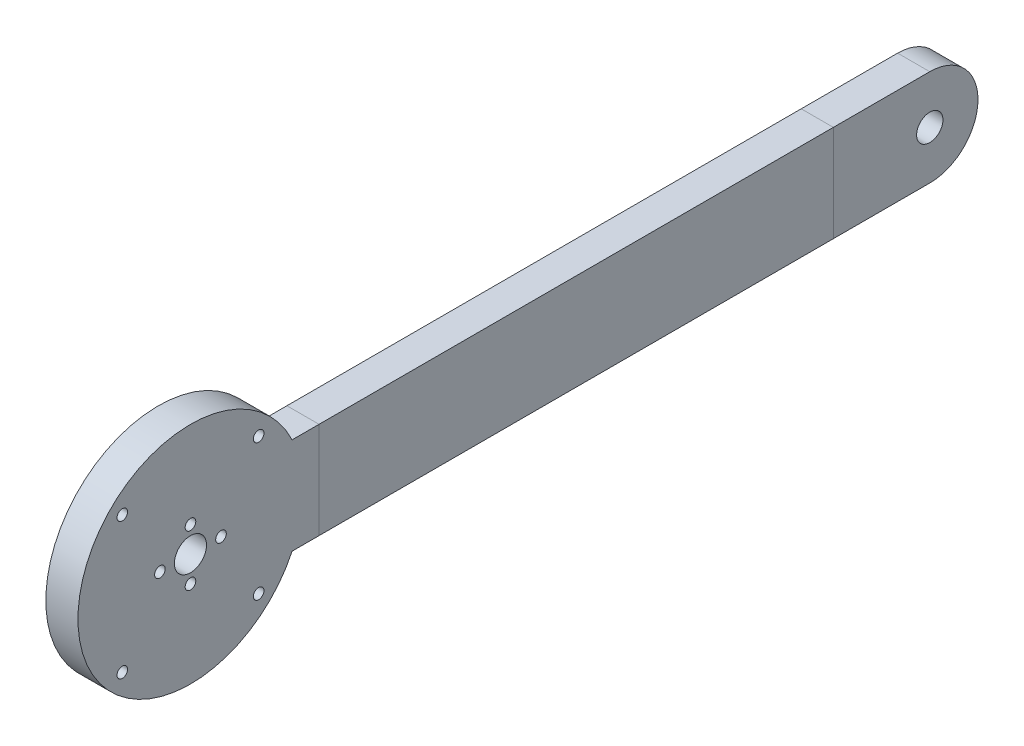
ISO-10303-21;
HEADER;
FILE_DESCRIPTION(('STEP AP214'),'2;1');
FILE_NAME('part.step','',(''),(''),'','','');
FILE_SCHEMA(('AUTOMOTIVE_DESIGN { 1 0 10303 214 1 1 1 1 }'));
ENDSEC;
DATA;
#1=APPLICATION_CONTEXT('core data for automotive mechanical design processes');
#2=APPLICATION_PROTOCOL_DEFINITION('international standard','automotive_design',2000,#1);
#3=PRODUCT_CONTEXT('',#1,'mechanical');
#4=PRODUCT('Part','Part','',(#3));
#5=PRODUCT_RELATED_PRODUCT_CATEGORY('part','',(#4));
#6=PRODUCT_DEFINITION_FORMATION('','',#4);
#7=PRODUCT_DEFINITION_CONTEXT('part definition',#1,'design');
#8=PRODUCT_DEFINITION('design','',#6,#7);
#9=PRODUCT_DEFINITION_SHAPE('','',#8);
#10=(LENGTH_UNIT() NAMED_UNIT(*) SI_UNIT(.MILLI.,.METRE.));
#11=(NAMED_UNIT(*) PLANE_ANGLE_UNIT() SI_UNIT($,.RADIAN.));
#12=(NAMED_UNIT(*) SI_UNIT($,.STERADIAN.) SOLID_ANGLE_UNIT());
#13=UNCERTAINTY_MEASURE_WITH_UNIT(LENGTH_MEASURE(1.E-05),#10,'distance_accuracy_value','');
#14=(GEOMETRIC_REPRESENTATION_CONTEXT(3) GLOBAL_UNCERTAINTY_ASSIGNED_CONTEXT((#13)) GLOBAL_UNIT_ASSIGNED_CONTEXT((#10,
#11,#12)) REPRESENTATION_CONTEXT('',''));
#15=CARTESIAN_POINT('',(0.,0.,0.));
#16=DIRECTION('',(0.,0.,1.));
#17=DIRECTION('',(1.,0.,0.));
#18=AXIS2_PLACEMENT_3D('',#15,#16,#17);
#19=CARTESIAN_POINT('',(0.,0.,30.));
#20=DIRECTION('',(0.,0.,1.));
#21=DIRECTION('',(1.,0.,0.));
#22=AXIS2_PLACEMENT_3D('',#19,#20,#21);
#23=PLANE('',#22);
#24=DIRECTION('',(1.,0.,0.));
#25=VECTOR('',#24,1.);
#26=CARTESIAN_POINT('',(10.,-15.,30.));
#27=LINE('',#26,#25);
#28=CARTESIAN_POINT('',(0.,-15.,30.));
#29=VERTEX_POINT('',#28);
#30=CARTESIAN_POINT('',(10.,-15.,30.));
#31=VERTEX_POINT('',#30);
#32=EDGE_CURVE('E105',#29,#31,#27,.T.);
#33=ORIENTED_EDGE('',*,*,#32,.T.);
#34=DIRECTION('',(0.,1.,0.));
#35=VECTOR('',#34,1.);
#36=CARTESIAN_POINT('',(10.,0.,30.));
#37=LINE('',#36,#35);
#38=CARTESIAN_POINT('',(10.,15.,30.));
#39=VERTEX_POINT('',#38);
#40=EDGE_CURVE('E107',#31,#39,#37,.T.);
#41=ORIENTED_EDGE('',*,*,#40,.T.);
#42=DIRECTION('',(-1.,0.,0.));
#43=VECTOR('',#42,1.);
#44=CARTESIAN_POINT('',(10.,15.,30.));
#45=LINE('',#44,#43);
#46=CARTESIAN_POINT('',(0.,15.,30.));
#47=VERTEX_POINT('',#46);
#48=EDGE_CURVE('E109',#39,#47,#45,.T.);
#49=ORIENTED_EDGE('',*,*,#48,.T.);
#50=DIRECTION('',(0.,1.,0.));
#51=VECTOR('',#50,1.);
#52=CARTESIAN_POINT('',(0.,0.,30.));
#53=LINE('',#52,#51);
#54=EDGE_CURVE('E95',#29,#47,#53,.T.);
#55=ORIENTED_EDGE('',*,*,#54,.F.);
#56=EDGE_LOOP('',(#33,#41,#49,#55));
#57=FACE_BOUND('',#56,.T.);
#58=ADVANCED_FACE('F53',(#57),#23,.T.);
#59=CARTESIAN_POINT('',(10.,0.,0.));
#60=DIRECTION('',(-1.,0.,0.));
#61=DIRECTION('',(0.,0.,1.));
#62=AXIS2_PLACEMENT_3D('',#59,#60,#61);
#63=CYLINDRICAL_SURFACE('',#62,15.);
#64=CARTESIAN_POINT('',(0.,0.,0.));
#65=DIRECTION('',(1.,0.,0.));
#66=DIRECTION('',(0.,0.,1.));
#67=AXIS2_PLACEMENT_3D('',#64,#65,#66);
#68=CIRCLE('',#67,15.);
#69=CARTESIAN_POINT('',(0.,-15.,0.));
#70=VERTEX_POINT('',#69);
#71=CARTESIAN_POINT('',(0.,15.,0.));
#72=VERTEX_POINT('',#71);
#73=EDGE_CURVE('E117',#70,#72,#68,.T.);
#74=ORIENTED_EDGE('',*,*,#73,.T.);
#75=DIRECTION('',(-1.,0.,0.));
#76=VECTOR('',#75,1.);
#77=CARTESIAN_POINT('',(10.,15.,0.));
#78=LINE('',#77,#76);
#79=CARTESIAN_POINT('',(10.,15.,0.));
#80=VERTEX_POINT('',#79);
#81=EDGE_CURVE('E129',#80,#72,#78,.T.);
#82=ORIENTED_EDGE('',*,*,#81,.F.);
#83=CARTESIAN_POINT('',(10.,0.,0.));
#84=DIRECTION('',(1.,0.,0.));
#85=DIRECTION('',(0.,0.,1.));
#86=AXIS2_PLACEMENT_3D('',#83,#84,#85);
#87=CIRCLE('',#86,15.);
#88=CARTESIAN_POINT('',(10.,-15.,0.));
#89=VERTEX_POINT('',#88);
#90=EDGE_CURVE('E119',#89,#80,#87,.T.);
#91=ORIENTED_EDGE('',*,*,#90,.F.);
#92=DIRECTION('',(-1.,0.,0.));
#93=VECTOR('',#92,1.);
#94=CARTESIAN_POINT('',(10.,-15.,0.));
#95=LINE('',#94,#93);
#96=EDGE_CURVE('E102',#89,#70,#95,.T.);
#97=ORIENTED_EDGE('',*,*,#96,.T.);
#98=EDGE_LOOP('',(#74,#82,#91,#97));
#99=FACE_BOUND('',#98,.T.);
#100=ADVANCED_FACE('F134',(#99),#63,.T.);
#101=CARTESIAN_POINT('',(10.,15.,0.));
#102=DIRECTION('',(0.,-1.,0.));
#103=DIRECTION('',(0.,0.,-1.));
#104=AXIS2_PLACEMENT_3D('',#101,#102,#103);
#105=PLANE('',#104);
#106=ORIENTED_EDGE('',*,*,#48,.F.);
#107=DIRECTION('',(0.,0.,1.));
#108=VECTOR('',#107,1.);
#109=CARTESIAN_POINT('',(10.,15.,0.));
#110=LINE('',#109,#108);
#111=EDGE_CURVE('E110',#80,#39,#110,.T.);
#112=ORIENTED_EDGE('',*,*,#111,.F.);
#113=ORIENTED_EDGE('',*,*,#81,.T.);
#114=DIRECTION('',(0.,0.,1.));
#115=VECTOR('',#114,1.);
#116=CARTESIAN_POINT('',(0.,15.,0.));
#117=LINE('',#116,#115);
#118=EDGE_CURVE('E74',#72,#47,#117,.T.);
#119=ORIENTED_EDGE('',*,*,#118,.T.);
#120=EDGE_LOOP('',(#106,#112,#113,#119));
#121=FACE_BOUND('',#120,.T.);
#122=ADVANCED_FACE('F128',(#121),#105,.F.);
#123=CARTESIAN_POINT('',(10.,-15.,0.));
#124=DIRECTION('',(0.,1.,0.));
#125=DIRECTION('',(0.,0.,1.));
#126=AXIS2_PLACEMENT_3D('',#123,#124,#125);
#127=PLANE('',#126);
#128=ORIENTED_EDGE('',*,*,#32,.F.);
#129=DIRECTION('',(0.,0.,-1.));
#130=VECTOR('',#129,1.);
#131=CARTESIAN_POINT('',(0.,-15.,0.));
#132=LINE('',#131,#130);
#133=EDGE_CURVE('E118',#29,#70,#132,.T.);
#134=ORIENTED_EDGE('',*,*,#133,.T.);
#135=ORIENTED_EDGE('',*,*,#96,.F.);
#136=DIRECTION('',(0.,0.,-1.));
#137=VECTOR('',#136,1.);
#138=CARTESIAN_POINT('',(10.,-15.,0.));
#139=LINE('',#138,#137);
#140=EDGE_CURVE('E59',#31,#89,#139,.T.);
#141=ORIENTED_EDGE('',*,*,#140,.F.);
#142=EDGE_LOOP('',(#128,#134,#135,#141));
#143=FACE_BOUND('',#142,.T.);
#144=ADVANCED_FACE('F103',(#143),#127,.F.);
#145=CARTESIAN_POINT('',(0.,0.,0.));
#146=DIRECTION('',(1.,0.,0.));
#147=DIRECTION('',(0.,0.,-1.));
#148=AXIS2_PLACEMENT_3D('',#145,#146,#147);
#149=CYLINDRICAL_SURFACE('',#148,4.1);
#150=CARTESIAN_POINT('',(0.,0.,0.));
#151=DIRECTION('',(1.,0.,0.));
#152=DIRECTION('',(0.,0.,-1.));
#153=AXIS2_PLACEMENT_3D('',#150,#151,#152);
#154=CIRCLE('',#153,4.1);
#155=CARTESIAN_POINT('',(0.,0.,-4.1));
#156=VERTEX_POINT('',#155);
#157=EDGE_CURVE('E61',#156,#156,#154,.T.);
#158=ORIENTED_EDGE('',*,*,#157,.F.);
#159=EDGE_LOOP('',(#158));
#160=FACE_BOUND('',#159,.T.);
#161=CARTESIAN_POINT('',(10.,0.,0.));
#162=DIRECTION('',(1.,0.,0.));
#163=DIRECTION('',(0.,0.,-1.));
#164=AXIS2_PLACEMENT_3D('',#161,#162,#163);
#165=CIRCLE('',#164,4.1);
#166=CARTESIAN_POINT('',(10.,0.,-4.1));
#167=VERTEX_POINT('',#166);
#168=EDGE_CURVE('E13',#167,#167,#165,.T.);
#169=ORIENTED_EDGE('',*,*,#168,.T.);
#170=EDGE_LOOP('',(#169));
#171=FACE_BOUND('',#170,.T.);
#172=ADVANCED_FACE('F137',(#160,#171),#149,.F.);
#173=CARTESIAN_POINT('',(0.,0.,0.));
#174=DIRECTION('',(-1.,0.,0.));
#175=DIRECTION('',(0.,0.,1.));
#176=AXIS2_PLACEMENT_3D('',#173,#174,#175);
#177=PLANE('',#176);
#178=ORIENTED_EDGE('',*,*,#157,.T.);
#179=EDGE_LOOP('',(#178));
#180=FACE_BOUND('',#179,.T.);
#181=ORIENTED_EDGE('',*,*,#133,.F.);
#182=ORIENTED_EDGE('',*,*,#54,.T.);
#183=ORIENTED_EDGE('',*,*,#118,.F.);
#184=ORIENTED_EDGE('',*,*,#73,.F.);
#185=EDGE_LOOP('',(#181,#182,#183,#184));
#186=FACE_BOUND('',#185,.T.);
#187=ADVANCED_FACE('F57',(#180,#186),#177,.T.);
#188=CARTESIAN_POINT('',(10.,0.,0.));
#189=DIRECTION('',(-1.,0.,0.));
#190=DIRECTION('',(0.,0.,1.));
#191=AXIS2_PLACEMENT_3D('',#188,#189,#190);
#192=PLANE('',#191);
#193=ORIENTED_EDGE('',*,*,#168,.F.);
#194=EDGE_LOOP('',(#193));
#195=FACE_BOUND('',#194,.T.);
#196=ORIENTED_EDGE('',*,*,#40,.F.);
#197=ORIENTED_EDGE('',*,*,#140,.T.);
#198=ORIENTED_EDGE('',*,*,#90,.T.);
#199=ORIENTED_EDGE('',*,*,#111,.T.);
#200=EDGE_LOOP('',(#196,#197,#198,#199));
#201=FACE_BOUND('',#200,.T.);
#202=ADVANCED_FACE('F115',(#195,#201),#192,.F.);
#203=CLOSED_SHELL('',(#58,#100,#122,#144,#172,#187,#202));
#204=MANIFOLD_SOLID_BREP('B2',#203);
#205=CARTESIAN_POINT('',(0.,0.,190.));
#206=DIRECTION('',(0.,0.,1.));
#207=DIRECTION('',(1.,0.,0.));
#208=AXIS2_PLACEMENT_3D('',#205,#206,#207);
#209=PLANE('',#208);
#210=DIRECTION('',(1.,0.,0.));
#211=VECTOR('',#210,1.);
#212=CARTESIAN_POINT('',(10.,-15.,190.));
#213=LINE('',#212,#211);
#214=CARTESIAN_POINT('',(0.,-15.,190.));
#215=VERTEX_POINT('',#214);
#216=CARTESIAN_POINT('',(10.,-15.,190.));
#217=VERTEX_POINT('',#216);
#218=EDGE_CURVE('E274',#215,#217,#213,.T.);
#219=ORIENTED_EDGE('',*,*,#218,.F.);
#220=DIRECTION('',(0.,1.,0.));
#221=VECTOR('',#220,1.);
#222=CARTESIAN_POINT('',(0.,0.,190.));
#223=LINE('',#222,#221);
#224=CARTESIAN_POINT('',(0.,15.,190.));
#225=VERTEX_POINT('',#224);
#226=EDGE_CURVE('E265',#215,#225,#223,.T.);
#227=ORIENTED_EDGE('',*,*,#226,.T.);
#228=DIRECTION('',(-1.,0.,0.));
#229=VECTOR('',#228,1.);
#230=CARTESIAN_POINT('',(10.,15.,190.));
#231=LINE('',#230,#229);
#232=CARTESIAN_POINT('',(10.,15.,190.));
#233=VERTEX_POINT('',#232);
#234=EDGE_CURVE('E272',#233,#225,#231,.T.);
#235=ORIENTED_EDGE('',*,*,#234,.F.);
#236=DIRECTION('',(0.,1.,0.));
#237=VECTOR('',#236,1.);
#238=CARTESIAN_POINT('',(10.,0.,190.));
#239=LINE('',#238,#237);
#240=EDGE_CURVE('E273',#217,#233,#239,.T.);
#241=ORIENTED_EDGE('',*,*,#240,.F.);
#242=EDGE_LOOP('',(#219,#227,#235,#241));
#243=FACE_BOUND('',#242,.T.);
#244=ADVANCED_FACE('F215',(#243),#209,.F.);
#245=CARTESIAN_POINT('',(10.,15.,0.));
#246=DIRECTION('',(0.,-1.,0.));
#247=DIRECTION('',(0.,0.,-1.));
#248=AXIS2_PLACEMENT_3D('',#245,#246,#247);
#249=PLANE('',#248);
#250=DIRECTION('',(0.,0.,1.));
#251=VECTOR('',#250,1.);
#252=CARTESIAN_POINT('',(10.,15.,0.));
#253=LINE('',#252,#251);
#254=CARTESIAN_POINT('',(10.,15.,198.377223398316));
#255=VERTEX_POINT('',#254);
#256=EDGE_CURVE('E217',#233,#255,#253,.T.);
#257=ORIENTED_EDGE('',*,*,#256,.F.);
#258=ORIENTED_EDGE('',*,*,#234,.T.);
#259=DIRECTION('',(0.,0.,1.));
#260=VECTOR('',#259,1.);
#261=CARTESIAN_POINT('',(0.,15.,0.));
#262=LINE('',#261,#260);
#263=CARTESIAN_POINT('',(0.,15.,198.377223398316));
#264=VERTEX_POINT('',#263);
#265=EDGE_CURVE('E230',#225,#264,#262,.T.);
#266=ORIENTED_EDGE('',*,*,#265,.T.);
#267=DIRECTION('',(1.,0.,0.));
#268=VECTOR('',#267,1.);
#269=CARTESIAN_POINT('',(0.,15.,198.377223398316));
#270=LINE('',#269,#268);
#271=EDGE_CURVE('E332',#264,#255,#270,.T.);
#272=ORIENTED_EDGE('',*,*,#271,.T.);
#273=EDGE_LOOP('',(#257,#258,#266,#272));
#274=FACE_BOUND('',#273,.T.);
#275=ADVANCED_FACE('F399',(#274),#249,.F.);
#276=CARTESIAN_POINT('',(10.,-15.,0.));
#277=DIRECTION('',(0.,1.,0.));
#278=DIRECTION('',(0.,0.,1.));
#279=AXIS2_PLACEMENT_3D('',#276,#277,#278);
#280=PLANE('',#279);
#281=DIRECTION('',(0.,0.,-1.));
#282=VECTOR('',#281,1.);
#283=CARTESIAN_POINT('',(0.,-15.,0.));
#284=LINE('',#283,#282);
#285=CARTESIAN_POINT('',(0.,-15.,198.377223398316));
#286=VERTEX_POINT('',#285);
#287=EDGE_CURVE('E269',#286,#215,#284,.T.);
#288=ORIENTED_EDGE('',*,*,#287,.T.);
#289=ORIENTED_EDGE('',*,*,#218,.T.);
#290=DIRECTION('',(0.,0.,-1.));
#291=VECTOR('',#290,1.);
#292=CARTESIAN_POINT('',(10.,-15.,0.));
#293=LINE('',#292,#291);
#294=CARTESIAN_POINT('',(10.,-15.,198.377223398316));
#295=VERTEX_POINT('',#294);
#296=EDGE_CURVE('E281',#295,#217,#293,.T.);
#297=ORIENTED_EDGE('',*,*,#296,.F.);
#298=DIRECTION('',(1.,0.,0.));
#299=VECTOR('',#298,1.);
#300=CARTESIAN_POINT('',(0.,-15.,198.377223398316));
#301=LINE('',#300,#299);
#302=EDGE_CURVE('E285',#295,#286,#301,.F.);
#303=ORIENTED_EDGE('',*,*,#302,.T.);
#304=EDGE_LOOP('',(#288,#289,#297,#303));
#305=FACE_BOUND('',#304,.T.);
#306=ADVANCED_FACE('F282',(#305),#280,.F.);
#307=CARTESIAN_POINT('',(10.,0.,0.));
#308=DIRECTION('',(-1.,0.,0.));
#309=DIRECTION('',(0.,0.,1.));
#310=AXIS2_PLACEMENT_3D('',#307,#308,#309);
#311=PLANE('',#310);
#312=CARTESIAN_POINT('',(10.,0.,239.5));
#313=DIRECTION('',(-1.,0.,0.));
#314=DIRECTION('',(0.,0.,1.));
#315=AXIS2_PLACEMENT_3D('',#312,#313,#314);
#316=CIRCLE('',#315,1.65000000000001);
#317=CARTESIAN_POINT('',(10.,0.,241.15));
#318=VERTEX_POINT('',#317);
#319=EDGE_CURVE('E292',#318,#318,#316,.T.);
#320=ORIENTED_EDGE('',*,*,#319,.T.);
#321=EDGE_LOOP('',(#320));
#322=FACE_BOUND('',#321,.T.);
#323=CARTESIAN_POINT('',(10.,-8.,230.));
#324=DIRECTION('',(-1.,0.,0.));
#325=DIRECTION('',(0.,0.,1.));
#326=AXIS2_PLACEMENT_3D('',#323,#324,#325);
#327=CIRCLE('',#326,1.65000000000001);
#328=CARTESIAN_POINT('',(10.,-8.,231.65));
#329=VERTEX_POINT('',#328);
#330=EDGE_CURVE('E294',#329,#329,#327,.T.);
#331=ORIENTED_EDGE('',*,*,#330,.T.);
#332=EDGE_LOOP('',(#331));
#333=FACE_BOUND('',#332,.T.);
#334=CARTESIAN_POINT('',(10.,0.,220.5));
#335=DIRECTION('',(-1.,0.,0.));
#336=DIRECTION('',(0.,0.,1.));
#337=AXIS2_PLACEMENT_3D('',#334,#335,#336);
#338=CIRCLE('',#337,1.65000000000001);
#339=CARTESIAN_POINT('',(10.,0.,222.15));
#340=VERTEX_POINT('',#339);
#341=EDGE_CURVE('E222',#340,#340,#338,.T.);
#342=ORIENTED_EDGE('',*,*,#341,.T.);
#343=EDGE_LOOP('',(#342));
#344=FACE_BOUND('',#343,.T.);
#345=CARTESIAN_POINT('',(10.,8.,230.));
#346=DIRECTION('',(-1.,0.,0.));
#347=DIRECTION('',(0.,0.,1.));
#348=AXIS2_PLACEMENT_3D('',#345,#346,#347);
#349=CIRCLE('',#348,1.65000000000001);
#350=CARTESIAN_POINT('',(10.,8.,231.65));
#351=VERTEX_POINT('',#350);
#352=EDGE_CURVE('E55',#351,#351,#349,.T.);
#353=ORIENTED_EDGE('',*,*,#352,.T.);
#354=EDGE_LOOP('',(#353));
#355=FACE_BOUND('',#354,.T.);
#356=CARTESIAN_POINT('',(10.,-21.2132034355964,208.786796564404));
#357=DIRECTION('',(1.,0.,0.));
#358=DIRECTION('',(0.,0.,-1.));
#359=AXIS2_PLACEMENT_3D('',#356,#357,#358);
#360=CIRCLE('',#359,1.65000000000001);
#361=CARTESIAN_POINT('',(10.,-21.2132034355964,207.136796564404));
#362=VERTEX_POINT('',#361);
#363=EDGE_CURVE('E313',#362,#362,#360,.T.);
#364=ORIENTED_EDGE('',*,*,#363,.F.);
#365=EDGE_LOOP('',(#364));
#366=FACE_BOUND('',#365,.T.);
#367=CARTESIAN_POINT('',(10.,21.2132034355964,208.786796564404));
#368=DIRECTION('',(1.,0.,0.));
#369=DIRECTION('',(0.,0.,-1.));
#370=AXIS2_PLACEMENT_3D('',#367,#368,#369);
#371=CIRCLE('',#370,1.65000000000001);
#372=CARTESIAN_POINT('',(10.,21.2132034355964,207.136796564404));
#373=VERTEX_POINT('',#372);
#374=EDGE_CURVE('E308',#373,#373,#371,.T.);
#375=ORIENTED_EDGE('',*,*,#374,.F.);
#376=EDGE_LOOP('',(#375));
#377=FACE_BOUND('',#376,.T.);
#378=CARTESIAN_POINT('',(10.,21.2132034355964,251.213203435596));
#379=DIRECTION('',(1.,0.,0.));
#380=DIRECTION('',(0.,0.,-1.));
#381=AXIS2_PLACEMENT_3D('',#378,#379,#380);
#382=CIRCLE('',#381,1.65000000000001);
#383=CARTESIAN_POINT('',(10.,21.2132034355964,249.563203435596));
#384=VERTEX_POINT('',#383);
#385=EDGE_CURVE('E301',#384,#384,#382,.T.);
#386=ORIENTED_EDGE('',*,*,#385,.F.);
#387=EDGE_LOOP('',(#386));
#388=FACE_BOUND('',#387,.T.);
#389=CARTESIAN_POINT('',(10.,-21.2132034355964,251.213203435596));
#390=DIRECTION('',(1.,0.,0.));
#391=DIRECTION('',(0.,0.,-1.));
#392=AXIS2_PLACEMENT_3D('',#389,#390,#391);
#393=CIRCLE('',#392,1.65000000000001);
#394=CARTESIAN_POINT('',(10.,-21.2132034355964,249.563203435596));
#395=VERTEX_POINT('',#394);
#396=EDGE_CURVE('E304',#395,#395,#393,.T.);
#397=ORIENTED_EDGE('',*,*,#396,.F.);
#398=EDGE_LOOP('',(#397));
#399=FACE_BOUND('',#398,.T.);
#400=ORIENTED_EDGE('',*,*,#296,.T.);
#401=ORIENTED_EDGE('',*,*,#240,.T.);
#402=ORIENTED_EDGE('',*,*,#256,.T.);
#403=CARTESIAN_POINT('',(10.,0.,230.));
#404=DIRECTION('',(1.,0.,0.));
#405=DIRECTION('',(0.,0.,-1.));
#406=AXIS2_PLACEMENT_3D('',#403,#404,#405);
#407=CIRCLE('',#406,35.);
#408=EDGE_CURVE('E321',#255,#295,#407,.T.);
#409=ORIENTED_EDGE('',*,*,#408,.T.);
#410=EDGE_LOOP('',(#400,#401,#402,#409));
#411=FACE_BOUND('',#410,.T.);
#412=CARTESIAN_POINT('',(10.,0.,230.));
#413=DIRECTION('',(1.,0.,0.));
#414=DIRECTION('',(0.,0.,-1.));
#415=AXIS2_PLACEMENT_3D('',#412,#413,#414);
#416=CIRCLE('',#415,5.00000000000001);
#417=CARTESIAN_POINT('',(10.,0.,225.));
#418=VERTEX_POINT('',#417);
#419=EDGE_CURVE('E334',#418,#418,#416,.T.);
#420=ORIENTED_EDGE('',*,*,#419,.F.);
#421=EDGE_LOOP('',(#420));
#422=FACE_BOUND('',#421,.T.);
#423=ADVANCED_FACE('F211',(#322,#333,#344,#355,#366,#377,#388,#399,#411,#422),#311,.F.);
#424=CARTESIAN_POINT('',(0.,0.,0.));
#425=DIRECTION('',(-1.,0.,0.));
#426=DIRECTION('',(0.,0.,1.));
#427=AXIS2_PLACEMENT_3D('',#424,#425,#426);
#428=PLANE('',#427);
#429=ORIENTED_EDGE('',*,*,#226,.F.);
#430=ORIENTED_EDGE('',*,*,#287,.F.);
#431=CARTESIAN_POINT('',(0.,0.,230.));
#432=DIRECTION('',(1.,0.,0.));
#433=DIRECTION('',(0.,0.,-1.));
#434=AXIS2_PLACEMENT_3D('',#431,#432,#433);
#435=CIRCLE('',#434,35.);
#436=EDGE_CURVE('E330',#264,#286,#435,.T.);
#437=ORIENTED_EDGE('',*,*,#436,.F.);
#438=ORIENTED_EDGE('',*,*,#265,.F.);
#439=EDGE_LOOP('',(#429,#430,#437,#438));
#440=FACE_BOUND('',#439,.T.);
#441=CARTESIAN_POINT('',(0.,0.,239.5));
#442=DIRECTION('',(-1.,0.,0.));
#443=DIRECTION('',(0.,0.,1.));
#444=AXIS2_PLACEMENT_3D('',#441,#442,#443);
#445=CIRCLE('',#444,3.);
#446=CARTESIAN_POINT('',(0.,0.,242.5));
#447=VERTEX_POINT('',#446);
#448=EDGE_CURVE('E293',#447,#447,#445,.F.);
#449=ORIENTED_EDGE('',*,*,#448,.T.);
#450=EDGE_LOOP('',(#449));
#451=FACE_BOUND('',#450,.T.);
#452=CARTESIAN_POINT('',(0.,0.,220.5));
#453=DIRECTION('',(-1.,0.,0.));
#454=DIRECTION('',(0.,0.,1.));
#455=AXIS2_PLACEMENT_3D('',#452,#453,#454);
#456=CIRCLE('',#455,3.);
#457=CARTESIAN_POINT('',(0.,0.,223.5));
#458=VERTEX_POINT('',#457);
#459=EDGE_CURVE('E342',#458,#458,#456,.F.);
#460=ORIENTED_EDGE('',*,*,#459,.T.);
#461=EDGE_LOOP('',(#460));
#462=FACE_BOUND('',#461,.T.);
#463=CARTESIAN_POINT('',(0.,-21.2132034355964,208.786796564404));
#464=DIRECTION('',(1.,0.,0.));
#465=DIRECTION('',(0.,0.,-1.));
#466=AXIS2_PLACEMENT_3D('',#463,#464,#465);
#467=CIRCLE('',#466,1.65000000000001);
#468=CARTESIAN_POINT('',(0.,-21.2132034355964,207.136796564404));
#469=VERTEX_POINT('',#468);
#470=EDGE_CURVE('E320',#469,#469,#467,.T.);
#471=ORIENTED_EDGE('',*,*,#470,.T.);
#472=EDGE_LOOP('',(#471));
#473=FACE_BOUND('',#472,.T.);
#474=CARTESIAN_POINT('',(0.,21.2132034355964,208.786796564404));
#475=DIRECTION('',(1.,0.,0.));
#476=DIRECTION('',(0.,0.,-1.));
#477=AXIS2_PLACEMENT_3D('',#474,#475,#476);
#478=CIRCLE('',#477,1.65000000000001);
#479=CARTESIAN_POINT('',(0.,21.2132034355964,207.136796564404));
#480=VERTEX_POINT('',#479);
#481=EDGE_CURVE('E311',#480,#480,#478,.T.);
#482=ORIENTED_EDGE('',*,*,#481,.T.);
#483=EDGE_LOOP('',(#482));
#484=FACE_BOUND('',#483,.T.);
#485=CARTESIAN_POINT('',(0.,21.2132034355964,251.213203435596));
#486=DIRECTION('',(1.,0.,0.));
#487=DIRECTION('',(0.,0.,-1.));
#488=AXIS2_PLACEMENT_3D('',#485,#486,#487);
#489=CIRCLE('',#488,1.65000000000001);
#490=CARTESIAN_POINT('',(0.,21.2132034355964,249.563203435596));
#491=VERTEX_POINT('',#490);
#492=EDGE_CURVE('E302',#491,#491,#489,.T.);
#493=ORIENTED_EDGE('',*,*,#492,.T.);
#494=EDGE_LOOP('',(#493));
#495=FACE_BOUND('',#494,.T.);
#496=CARTESIAN_POINT('',(0.,-21.2132034355964,251.213203435596));
#497=DIRECTION('',(1.,0.,0.));
#498=DIRECTION('',(0.,0.,-1.));
#499=AXIS2_PLACEMENT_3D('',#496,#497,#498);
#500=CIRCLE('',#499,1.65000000000001);
#501=CARTESIAN_POINT('',(0.,-21.2132034355964,249.563203435596));
#502=VERTEX_POINT('',#501);
#503=EDGE_CURVE('E322',#502,#502,#500,.T.);
#504=ORIENTED_EDGE('',*,*,#503,.T.);
#505=EDGE_LOOP('',(#504));
#506=FACE_BOUND('',#505,.T.);
#507=CARTESIAN_POINT('',(0.,0.,230.));
#508=DIRECTION('',(1.,0.,0.));
#509=DIRECTION('',(0.,0.,-1.));
#510=AXIS2_PLACEMENT_3D('',#507,#508,#509);
#511=CIRCLE('',#510,5.00000000000001);
#512=CARTESIAN_POINT('',(0.,5.,230.));
#513=VERTEX_POINT('',#512);
#514=CARTESIAN_POINT('',(0.,-5.,230.));
#515=VERTEX_POINT('',#514);
#516=EDGE_CURVE('E284',#513,#515,#511,.T.);
#517=ORIENTED_EDGE('',*,*,#516,.T.);
#518=CARTESIAN_POINT('',(0.,-8.,230.));
#519=DIRECTION('',(-1.,0.,0.));
#520=DIRECTION('',(0.,0.,1.));
#521=AXIS2_PLACEMENT_3D('',#518,#519,#520);
#522=CIRCLE('',#521,3.);
#523=EDGE_CURVE('E341',#515,#515,#522,.F.);
#524=ORIENTED_EDGE('',*,*,#523,.T.);
#525=EDGE_CURVE('E337',#515,#513,#511,.T.);
#526=ORIENTED_EDGE('',*,*,#525,.T.);
#527=CARTESIAN_POINT('',(0.,8.,230.));
#528=DIRECTION('',(-1.,0.,0.));
#529=DIRECTION('',(0.,0.,1.));
#530=AXIS2_PLACEMENT_3D('',#527,#528,#529);
#531=CIRCLE('',#530,3.);
#532=EDGE_CURVE('E290',#513,#513,#531,.F.);
#533=ORIENTED_EDGE('',*,*,#532,.T.);
#534=EDGE_LOOP('',(#517,#524,#526,#533));
#535=FACE_BOUND('',#534,.T.);
#536=ADVANCED_FACE('F264',(#440,#451,#462,#473,#484,#495,#506,#535),#428,.T.);
#537=CARTESIAN_POINT('',(0.,0.,230.));
#538=DIRECTION('',(1.,0.,0.));
#539=DIRECTION('',(0.,0.,-1.));
#540=AXIS2_PLACEMENT_3D('',#537,#538,#539);
#541=CYLINDRICAL_SURFACE('',#540,5.00000000000001);
#542=ORIENTED_EDGE('',*,*,#516,.F.);
#543=ORIENTED_EDGE('',*,*,#525,.F.);
#544=EDGE_LOOP('',(#542,#543));
#545=FACE_BOUND('',#544,.T.);
#546=ORIENTED_EDGE('',*,*,#419,.T.);
#547=EDGE_LOOP('',(#546));
#548=FACE_BOUND('',#547,.T.);
#549=ADVANCED_FACE('F375',(#545,#548),#541,.F.);
#550=CARTESIAN_POINT('',(0.,0.,230.));
#551=DIRECTION('',(1.,0.,0.));
#552=DIRECTION('',(0.,0.,-1.));
#553=AXIS2_PLACEMENT_3D('',#550,#551,#552);
#554=CYLINDRICAL_SURFACE('',#553,35.);
#555=ORIENTED_EDGE('',*,*,#271,.F.);
#556=ORIENTED_EDGE('',*,*,#436,.T.);
#557=ORIENTED_EDGE('',*,*,#302,.F.);
#558=ORIENTED_EDGE('',*,*,#408,.F.);
#559=EDGE_LOOP('',(#555,#556,#557,#558));
#560=FACE_BOUND('',#559,.T.);
#561=ADVANCED_FACE('F386',(#560),#554,.T.);
#562=CARTESIAN_POINT('',(0.,-21.2132034355964,251.213203435596));
#563=DIRECTION('',(1.,0.,0.));
#564=DIRECTION('',(0.,0.,-1.));
#565=AXIS2_PLACEMENT_3D('',#562,#563,#564);
#566=CYLINDRICAL_SURFACE('',#565,1.65000000000001);
#567=ORIENTED_EDGE('',*,*,#503,.F.);
#568=EDGE_LOOP('',(#567));
#569=FACE_BOUND('',#568,.T.);
#570=ORIENTED_EDGE('',*,*,#396,.T.);
#571=EDGE_LOOP('',(#570));
#572=FACE_BOUND('',#571,.T.);
#573=ADVANCED_FACE('F429',(#569,#572),#566,.F.);
#574=CARTESIAN_POINT('',(0.,21.2132034355964,251.213203435596));
#575=DIRECTION('',(1.,0.,0.));
#576=DIRECTION('',(0.,0.,-1.));
#577=AXIS2_PLACEMENT_3D('',#574,#575,#576);
#578=CYLINDRICAL_SURFACE('',#577,1.65000000000001);
#579=ORIENTED_EDGE('',*,*,#492,.F.);
#580=EDGE_LOOP('',(#579));
#581=FACE_BOUND('',#580,.T.);
#582=ORIENTED_EDGE('',*,*,#385,.T.);
#583=EDGE_LOOP('',(#582));
#584=FACE_BOUND('',#583,.T.);
#585=ADVANCED_FACE('F424',(#581,#584),#578,.F.);
#586=CARTESIAN_POINT('',(0.,21.2132034355964,208.786796564404));
#587=DIRECTION('',(1.,0.,0.));
#588=DIRECTION('',(0.,0.,-1.));
#589=AXIS2_PLACEMENT_3D('',#586,#587,#588);
#590=CYLINDRICAL_SURFACE('',#589,1.65000000000001);
#591=ORIENTED_EDGE('',*,*,#481,.F.);
#592=EDGE_LOOP('',(#591));
#593=FACE_BOUND('',#592,.T.);
#594=ORIENTED_EDGE('',*,*,#374,.T.);
#595=EDGE_LOOP('',(#594));
#596=FACE_BOUND('',#595,.T.);
#597=ADVANCED_FACE('F426',(#593,#596),#590,.F.);
#598=CARTESIAN_POINT('',(0.,-21.2132034355964,208.786796564404));
#599=DIRECTION('',(1.,0.,0.));
#600=DIRECTION('',(0.,0.,-1.));
#601=AXIS2_PLACEMENT_3D('',#598,#599,#600);
#602=CYLINDRICAL_SURFACE('',#601,1.65000000000001);
#603=ORIENTED_EDGE('',*,*,#470,.F.);
#604=EDGE_LOOP('',(#603));
#605=FACE_BOUND('',#604,.T.);
#606=ORIENTED_EDGE('',*,*,#363,.T.);
#607=EDGE_LOOP('',(#606));
#608=FACE_BOUND('',#607,.T.);
#609=ADVANCED_FACE('F370',(#605,#608),#602,.F.);
#610=CARTESIAN_POINT('',(0.,0.,239.5));
#611=DIRECTION('',(-1.,0.,0.));
#612=DIRECTION('',(0.,0.,1.));
#613=AXIS2_PLACEMENT_3D('',#610,#611,#612);
#614=CONICAL_SURFACE('',#613,3.,0.785398163397456);
#615=CARTESIAN_POINT('',(1.34999999999997,0.,239.5));
#616=DIRECTION('',(-1.,0.,0.));
#617=DIRECTION('',(0.,0.,1.));
#618=AXIS2_PLACEMENT_3D('',#615,#616,#617);
#619=CIRCLE('',#618,1.65000000000001);
#620=CARTESIAN_POINT('',(1.34999999999997,0.,241.15));
#621=VERTEX_POINT('',#620);
#622=EDGE_CURVE('E318',#621,#621,#619,.T.);
#623=ORIENTED_EDGE('',*,*,#622,.F.);
#624=EDGE_LOOP('',(#623));
#625=FACE_BOUND('',#624,.T.);
#626=ORIENTED_EDGE('',*,*,#448,.F.);
#627=EDGE_LOOP('',(#626));
#628=FACE_BOUND('',#627,.T.);
#629=ADVANCED_FACE('F361',(#625,#628),#614,.F.);
#630=CARTESIAN_POINT('',(0.,-8.,230.));
#631=DIRECTION('',(-1.,0.,0.));
#632=DIRECTION('',(0.,0.,1.));
#633=AXIS2_PLACEMENT_3D('',#630,#631,#632);
#634=CONICAL_SURFACE('',#633,3.,0.785398163397456);
#635=CARTESIAN_POINT('',(1.34999999999997,-8.,230.));
#636=DIRECTION('',(-1.,0.,0.));
#637=DIRECTION('',(0.,0.,1.));
#638=AXIS2_PLACEMENT_3D('',#635,#636,#637);
#639=CIRCLE('',#638,1.65000000000001);
#640=CARTESIAN_POINT('',(1.34999999999997,-8.,231.65));
#641=VERTEX_POINT('',#640);
#642=EDGE_CURVE('E351',#641,#641,#639,.T.);
#643=ORIENTED_EDGE('',*,*,#642,.F.);
#644=EDGE_LOOP('',(#643));
#645=FACE_BOUND('',#644,.T.);
#646=ORIENTED_EDGE('',*,*,#523,.F.);
#647=EDGE_LOOP('',(#646));
#648=FACE_BOUND('',#647,.T.);
#649=ADVANCED_FACE('F366',(#645,#648),#634,.F.);
#650=CARTESIAN_POINT('',(0.,0.,220.5));
#651=DIRECTION('',(-1.,0.,0.));
#652=DIRECTION('',(0.,0.,1.));
#653=AXIS2_PLACEMENT_3D('',#650,#651,#652);
#654=CONICAL_SURFACE('',#653,3.,0.785398163397456);
#655=CARTESIAN_POINT('',(1.34999999999997,0.,220.5));
#656=DIRECTION('',(-1.,0.,0.));
#657=DIRECTION('',(0.,0.,1.));
#658=AXIS2_PLACEMENT_3D('',#655,#656,#657);
#659=CIRCLE('',#658,1.65000000000001);
#660=CARTESIAN_POINT('',(1.34999999999997,0.,222.15));
#661=VERTEX_POINT('',#660);
#662=EDGE_CURVE('E352',#661,#661,#659,.T.);
#663=ORIENTED_EDGE('',*,*,#662,.F.);
#664=EDGE_LOOP('',(#663));
#665=FACE_BOUND('',#664,.T.);
#666=ORIENTED_EDGE('',*,*,#459,.F.);
#667=EDGE_LOOP('',(#666));
#668=FACE_BOUND('',#667,.T.);
#669=ADVANCED_FACE('F455',(#665,#668),#654,.F.);
#670=CARTESIAN_POINT('',(0.,8.,230.));
#671=DIRECTION('',(-1.,0.,0.));
#672=DIRECTION('',(0.,0.,1.));
#673=AXIS2_PLACEMENT_3D('',#670,#671,#672);
#674=CONICAL_SURFACE('',#673,3.,0.785398163397456);
#675=CARTESIAN_POINT('',(1.34999999999997,8.,230.));
#676=DIRECTION('',(-1.,0.,0.));
#677=DIRECTION('',(0.,0.,1.));
#678=AXIS2_PLACEMENT_3D('',#675,#676,#677);
#679=CIRCLE('',#678,1.65000000000001);
#680=CARTESIAN_POINT('',(1.34999999999997,8.,231.65));
#681=VERTEX_POINT('',#680);
#682=EDGE_CURVE('E298',#681,#681,#679,.T.);
#683=ORIENTED_EDGE('',*,*,#682,.F.);
#684=EDGE_LOOP('',(#683));
#685=FACE_BOUND('',#684,.T.);
#686=ORIENTED_EDGE('',*,*,#532,.F.);
#687=EDGE_LOOP('',(#686));
#688=FACE_BOUND('',#687,.T.);
#689=ADVANCED_FACE('F421',(#685,#688),#674,.F.);
#690=CARTESIAN_POINT('',(10.,8.,230.));
#691=DIRECTION('',(-1.,0.,0.));
#692=DIRECTION('',(0.,0.,1.));
#693=AXIS2_PLACEMENT_3D('',#690,#691,#692);
#694=CYLINDRICAL_SURFACE('',#693,1.65000000000001);
#695=ORIENTED_EDGE('',*,*,#682,.T.);
#696=EDGE_LOOP('',(#695));
#697=FACE_BOUND('',#696,.T.);
#698=ORIENTED_EDGE('',*,*,#352,.F.);
#699=EDGE_LOOP('',(#698));
#700=FACE_BOUND('',#699,.T.);
#701=ADVANCED_FACE('F416',(#697,#700),#694,.F.);
#702=CARTESIAN_POINT('',(10.,0.,220.5));
#703=DIRECTION('',(-1.,0.,0.));
#704=DIRECTION('',(0.,0.,1.));
#705=AXIS2_PLACEMENT_3D('',#702,#703,#704);
#706=CYLINDRICAL_SURFACE('',#705,1.65000000000001);
#707=ORIENTED_EDGE('',*,*,#662,.T.);
#708=EDGE_LOOP('',(#707));
#709=FACE_BOUND('',#708,.T.);
#710=ORIENTED_EDGE('',*,*,#341,.F.);
#711=EDGE_LOOP('',(#710));
#712=FACE_BOUND('',#711,.T.);
#713=ADVANCED_FACE('F413',(#709,#712),#706,.F.);
#714=CARTESIAN_POINT('',(10.,-8.,230.));
#715=DIRECTION('',(-1.,0.,0.));
#716=DIRECTION('',(0.,0.,1.));
#717=AXIS2_PLACEMENT_3D('',#714,#715,#716);
#718=CYLINDRICAL_SURFACE('',#717,1.65000000000001);
#719=ORIENTED_EDGE('',*,*,#642,.T.);
#720=EDGE_LOOP('',(#719));
#721=FACE_BOUND('',#720,.T.);
#722=ORIENTED_EDGE('',*,*,#330,.F.);
#723=EDGE_LOOP('',(#722));
#724=FACE_BOUND('',#723,.T.);
#725=ADVANCED_FACE('F406',(#721,#724),#718,.F.);
#726=CARTESIAN_POINT('',(10.,0.,239.5));
#727=DIRECTION('',(-1.,0.,0.));
#728=DIRECTION('',(0.,0.,1.));
#729=AXIS2_PLACEMENT_3D('',#726,#727,#728);
#730=CYLINDRICAL_SURFACE('',#729,1.65000000000001);
#731=ORIENTED_EDGE('',*,*,#622,.T.);
#732=EDGE_LOOP('',(#731));
#733=FACE_BOUND('',#732,.T.);
#734=ORIENTED_EDGE('',*,*,#319,.F.);
#735=EDGE_LOOP('',(#734));
#736=FACE_BOUND('',#735,.T.);
#737=ADVANCED_FACE('F359',(#733,#736),#730,.F.);
#738=CLOSED_SHELL('',(#244,#275,#306,#423,#536,#549,#561,#573,#585,#597,#609,#629,#649,#669,
#689,#701,#713,#725,#737));
#739=MANIFOLD_SOLID_BREP('B7',#738);
#740=CARTESIAN_POINT('',(0.,0.,30.));
#741=DIRECTION('',(0.,0.,1.));
#742=DIRECTION('',(1.,0.,0.));
#743=AXIS2_PLACEMENT_3D('',#740,#741,#742);
#744=PLANE('',#743);
#745=DIRECTION('',(1.,0.,0.));
#746=VECTOR('',#745,1.);
#747=CARTESIAN_POINT('',(10.,-15.,30.));
#748=LINE('',#747,#746);
#749=CARTESIAN_POINT('',(0.,-15.,30.));
#750=VERTEX_POINT('',#749);
#751=CARTESIAN_POINT('',(10.,-15.,30.));
#752=VERTEX_POINT('',#751);
#753=EDGE_CURVE('E674',#750,#752,#748,.T.);
#754=ORIENTED_EDGE('',*,*,#753,.F.);
#755=DIRECTION('',(0.,1.,0.));
#756=VECTOR('',#755,1.);
#757=CARTESIAN_POINT('',(0.,0.,30.));
#758=LINE('',#757,#756);
#759=CARTESIAN_POINT('',(0.,15.,30.));
#760=VERTEX_POINT('',#759);
#761=EDGE_CURVE('E208',#750,#760,#758,.T.);
#762=ORIENTED_EDGE('',*,*,#761,.T.);
#763=DIRECTION('',(-1.,0.,0.));
#764=VECTOR('',#763,1.);
#765=CARTESIAN_POINT('',(10.,15.,30.));
#766=LINE('',#765,#764);
#767=CARTESIAN_POINT('',(10.,15.,30.));
#768=VERTEX_POINT('',#767);
#769=EDGE_CURVE('E630',#768,#760,#766,.T.);
#770=ORIENTED_EDGE('',*,*,#769,.F.);
#771=DIRECTION('',(0.,1.,0.));
#772=VECTOR('',#771,1.);
#773=CARTESIAN_POINT('',(10.,0.,30.));
#774=LINE('',#773,#772);
#775=EDGE_CURVE('E657',#752,#768,#774,.T.);
#776=ORIENTED_EDGE('',*,*,#775,.F.);
#777=EDGE_LOOP('',(#754,#762,#770,#776));
#778=FACE_BOUND('',#777,.T.);
#779=ADVANCED_FACE('F607',(#778),#744,.F.);
#780=CARTESIAN_POINT('',(0.,0.,190.));
#781=DIRECTION('',(0.,0.,1.));
#782=DIRECTION('',(1.,0.,0.));
#783=AXIS2_PLACEMENT_3D('',#780,#781,#782);
#784=PLANE('',#783);
#785=DIRECTION('',(1.,0.,0.));
#786=VECTOR('',#785,1.);
#787=CARTESIAN_POINT('',(10.,-15.,190.));
#788=LINE('',#787,#786);
#789=CARTESIAN_POINT('',(0.,-15.,190.));
#790=VERTEX_POINT('',#789);
#791=CARTESIAN_POINT('',(10.,-15.,190.));
#792=VERTEX_POINT('',#791);
#793=EDGE_CURVE('E655',#790,#792,#788,.T.);
#794=ORIENTED_EDGE('',*,*,#793,.T.);
#795=DIRECTION('',(0.,1.,0.));
#796=VECTOR('',#795,1.);
#797=CARTESIAN_POINT('',(10.,0.,190.));
#798=LINE('',#797,#796);
#799=CARTESIAN_POINT('',(10.,15.,190.));
#800=VERTEX_POINT('',#799);
#801=EDGE_CURVE('E609',#792,#800,#798,.T.);
#802=ORIENTED_EDGE('',*,*,#801,.T.);
#803=DIRECTION('',(-1.,0.,0.));
#804=VECTOR('',#803,1.);
#805=CARTESIAN_POINT('',(10.,15.,190.));
#806=LINE('',#805,#804);
#807=CARTESIAN_POINT('',(0.,15.,190.));
#808=VERTEX_POINT('',#807);
#809=EDGE_CURVE('E651',#800,#808,#806,.T.);
#810=ORIENTED_EDGE('',*,*,#809,.T.);
#811=DIRECTION('',(0.,1.,0.));
#812=VECTOR('',#811,1.);
#813=CARTESIAN_POINT('',(0.,0.,190.));
#814=LINE('',#813,#812);
#815=EDGE_CURVE('E649',#790,#808,#814,.T.);
#816=ORIENTED_EDGE('',*,*,#815,.F.);
#817=EDGE_LOOP('',(#794,#802,#810,#816));
#818=FACE_BOUND('',#817,.T.);
#819=ADVANCED_FACE('F648',(#818),#784,.T.);
#820=CARTESIAN_POINT('',(10.,15.,0.));
#821=DIRECTION('',(0.,-1.,0.));
#822=DIRECTION('',(0.,0.,-1.));
#823=AXIS2_PLACEMENT_3D('',#820,#821,#822);
#824=PLANE('',#823);
#825=ORIENTED_EDGE('',*,*,#809,.F.);
#826=DIRECTION('',(0.,0.,1.));
#827=VECTOR('',#826,1.);
#828=CARTESIAN_POINT('',(10.,15.,0.));
#829=LINE('',#828,#827);
#830=EDGE_CURVE('E670',#768,#800,#829,.T.);
#831=ORIENTED_EDGE('',*,*,#830,.F.);
#832=ORIENTED_EDGE('',*,*,#769,.T.);
#833=DIRECTION('',(0.,0.,1.));
#834=VECTOR('',#833,1.);
#835=CARTESIAN_POINT('',(0.,15.,0.));
#836=LINE('',#835,#834);
#837=EDGE_CURVE('E669',#760,#808,#836,.T.);
#838=ORIENTED_EDGE('',*,*,#837,.T.);
#839=EDGE_LOOP('',(#825,#831,#832,#838));
#840=FACE_BOUND('',#839,.T.);
#841=ADVANCED_FACE('F678',(#840),#824,.F.);
#842=CARTESIAN_POINT('',(10.,-15.,0.));
#843=DIRECTION('',(0.,1.,0.));
#844=DIRECTION('',(0.,0.,1.));
#845=AXIS2_PLACEMENT_3D('',#842,#843,#844);
#846=PLANE('',#845);
#847=ORIENTED_EDGE('',*,*,#793,.F.);
#848=DIRECTION('',(0.,0.,-1.));
#849=VECTOR('',#848,1.);
#850=CARTESIAN_POINT('',(0.,-15.,0.));
#851=LINE('',#850,#849);
#852=EDGE_CURVE('E661',#790,#750,#851,.T.);
#853=ORIENTED_EDGE('',*,*,#852,.T.);
#854=ORIENTED_EDGE('',*,*,#753,.T.);
#855=DIRECTION('',(0.,0.,-1.));
#856=VECTOR('',#855,1.);
#857=CARTESIAN_POINT('',(10.,-15.,0.));
#858=LINE('',#857,#856);
#859=EDGE_CURVE('E660',#792,#752,#858,.T.);
#860=ORIENTED_EDGE('',*,*,#859,.F.);
#861=EDGE_LOOP('',(#847,#853,#854,#860));
#862=FACE_BOUND('',#861,.T.);
#863=ADVANCED_FACE('F662',(#862),#846,.F.);
#864=CARTESIAN_POINT('',(0.,0.,0.));
#865=DIRECTION('',(-1.,0.,0.));
#866=DIRECTION('',(0.,0.,1.));
#867=AXIS2_PLACEMENT_3D('',#864,#865,#866);
#868=PLANE('',#867);
#869=ORIENTED_EDGE('',*,*,#852,.F.);
#870=ORIENTED_EDGE('',*,*,#815,.T.);
#871=ORIENTED_EDGE('',*,*,#837,.F.);
#872=ORIENTED_EDGE('',*,*,#761,.F.);
#873=EDGE_LOOP('',(#869,#870,#871,#872));
#874=FACE_BOUND('',#873,.T.);
#875=ADVANCED_FACE('F667',(#874),#868,.T.);
#876=CARTESIAN_POINT('',(10.,0.,0.));
#877=DIRECTION('',(-1.,0.,0.));
#878=DIRECTION('',(0.,0.,1.));
#879=AXIS2_PLACEMENT_3D('',#876,#877,#878);
#880=PLANE('',#879);
#881=ORIENTED_EDGE('',*,*,#801,.F.);
#882=ORIENTED_EDGE('',*,*,#859,.T.);
#883=ORIENTED_EDGE('',*,*,#775,.T.);
#884=ORIENTED_EDGE('',*,*,#830,.T.);
#885=EDGE_LOOP('',(#881,#882,#883,#884));
#886=FACE_BOUND('',#885,.T.);
#887=ADVANCED_FACE('F679',(#886),#880,.F.);
#888=CLOSED_SHELL('',(#779,#819,#841,#863,#875,#887));
#889=MANIFOLD_SOLID_BREP('B46',#888);
#890=ADVANCED_BREP_SHAPE_REPRESENTATION('',(#18,#204,#739,#889),#14);
#891=SHAPE_DEFINITION_REPRESENTATION(#9,#890);
ENDSEC;
END-ISO-10303-21;
